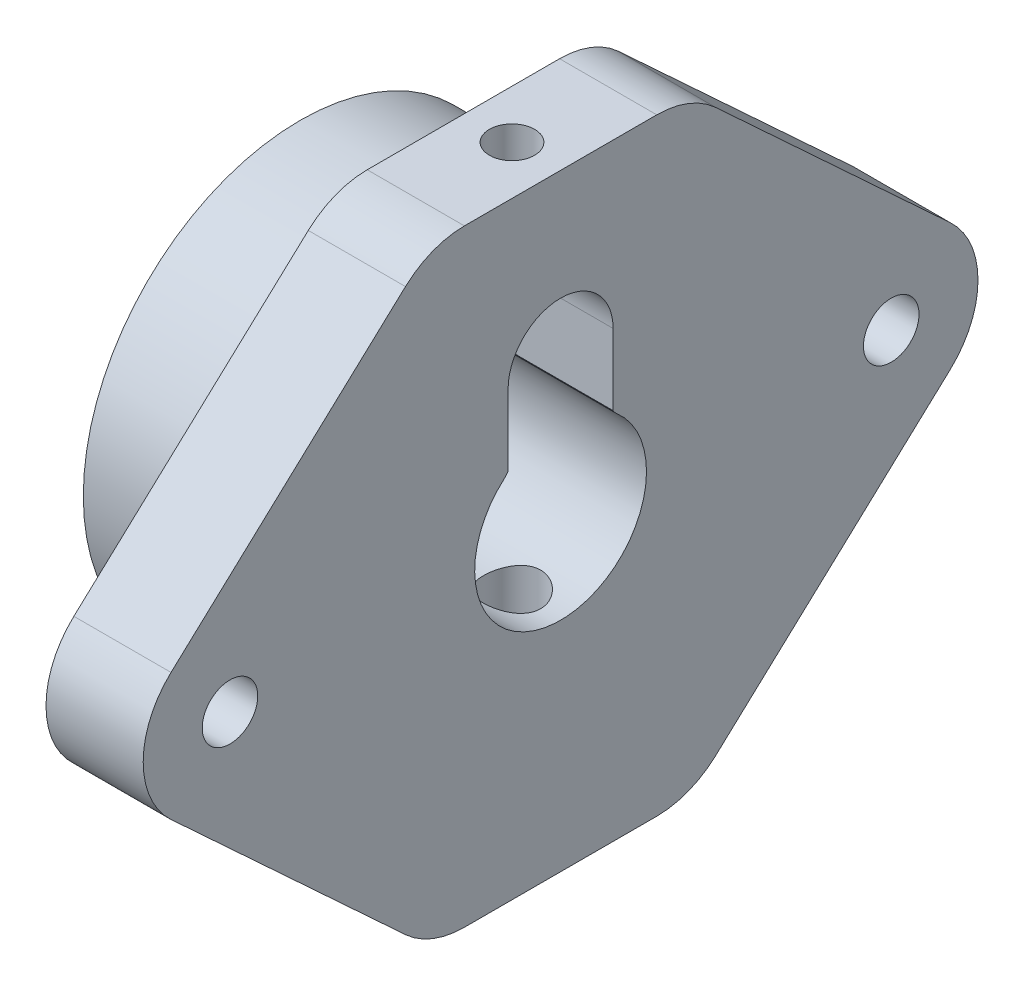
ISO-10303-21;
HEADER;
FILE_DESCRIPTION(('STEP AP214'),'2;1');
FILE_NAME('part.step','',(''),(''),'','','');
FILE_SCHEMA(('AUTOMOTIVE_DESIGN { 1 0 10303 214 1 1 1 1 }'));
ENDSEC;
DATA;
#1=APPLICATION_CONTEXT('core data for automotive mechanical design processes');
#2=APPLICATION_PROTOCOL_DEFINITION('international standard','automotive_design',2000,#1);
#3=PRODUCT_CONTEXT('',#1,'mechanical');
#4=PRODUCT('Part','Part','',(#3));
#5=PRODUCT_RELATED_PRODUCT_CATEGORY('part','',(#4));
#6=PRODUCT_DEFINITION_FORMATION('','',#4);
#7=PRODUCT_DEFINITION_CONTEXT('part definition',#1,'design');
#8=PRODUCT_DEFINITION('design','',#6,#7);
#9=PRODUCT_DEFINITION_SHAPE('','',#8);
#10=(LENGTH_UNIT() NAMED_UNIT(*) SI_UNIT(.MILLI.,.METRE.));
#11=(NAMED_UNIT(*) PLANE_ANGLE_UNIT() SI_UNIT($,.RADIAN.));
#12=(NAMED_UNIT(*) SI_UNIT($,.STERADIAN.) SOLID_ANGLE_UNIT());
#13=UNCERTAINTY_MEASURE_WITH_UNIT(LENGTH_MEASURE(1.E-05),#10,'distance_accuracy_value','');
#14=(GEOMETRIC_REPRESENTATION_CONTEXT(3) GLOBAL_UNCERTAINTY_ASSIGNED_CONTEXT((#13)) GLOBAL_UNIT_ASSIGNED_CONTEXT((#10,
#11,#12)) REPRESENTATION_CONTEXT('',''));
#15=CARTESIAN_POINT('',(0.,0.,0.));
#16=DIRECTION('',(0.,0.,1.));
#17=DIRECTION('',(1.,0.,0.));
#18=AXIS2_PLACEMENT_3D('',#15,#16,#17);
#19=CARTESIAN_POINT('',(0.,-17.5,0.));
#20=DIRECTION('',(0.,1.,0.));
#21=DIRECTION('',(0.,0.,1.));
#22=AXIS2_PLACEMENT_3D('',#19,#20,#21);
#23=PLANE('',#22);
#24=CARTESIAN_POINT('',(12.2,-17.5,0.));
#25=DIRECTION('',(0.,-1.,0.));
#26=DIRECTION('',(0.,0.,-1.));
#27=AXIS2_PLACEMENT_3D('',#24,#25,#26);
#28=CIRCLE('',#27,1.65);
#29=CARTESIAN_POINT('',(12.2,-17.5,-1.65));
#30=VERTEX_POINT('',#29);
#31=EDGE_CURVE('E421',#30,#30,#28,.T.);
#32=ORIENTED_EDGE('',*,*,#31,.F.);
#33=EDGE_LOOP('',(#32));
#34=FACE_BOUND('',#33,.T.);
#35=DIRECTION('',(0.,0.,1.));
#36=VECTOR('',#35,1.);
#37=CARTESIAN_POINT('',(9.4,-17.5,0.));
#38=LINE('',#37,#36);
#39=CARTESIAN_POINT('',(9.4,-17.5,-5.5415515668414));
#40=VERTEX_POINT('',#39);
#41=CARTESIAN_POINT('',(9.4,-17.5,5.5415515668414));
#42=VERTEX_POINT('',#41);
#43=EDGE_CURVE('E263',#40,#42,#38,.T.);
#44=ORIENTED_EDGE('',*,*,#43,.F.);
#45=DIRECTION('',(-1.,0.,0.));
#46=VECTOR('',#45,1.);
#47=CARTESIAN_POINT('',(15.,-17.5,-5.5415515668414));
#48=LINE('',#47,#46);
#49=CARTESIAN_POINT('',(15.,-17.5,-5.5415515668414));
#50=VERTEX_POINT('',#49);
#51=EDGE_CURVE('E458',#40,#50,#48,.F.);
#52=ORIENTED_EDGE('',*,*,#51,.T.);
#53=DIRECTION('',(0.,0.,1.));
#54=VECTOR('',#53,1.);
#55=CARTESIAN_POINT('',(15.,-17.5,0.));
#56=LINE('',#55,#54);
#57=CARTESIAN_POINT('',(15.,-17.5,5.5415515668414));
#58=VERTEX_POINT('',#57);
#59=EDGE_CURVE('E259',#50,#58,#56,.T.);
#60=ORIENTED_EDGE('',*,*,#59,.T.);
#61=DIRECTION('',(-1.,0.,0.));
#62=VECTOR('',#61,1.);
#63=CARTESIAN_POINT('',(0.,-17.5,5.5415515668414));
#64=LINE('',#63,#62);
#65=EDGE_CURVE('E460',#58,#42,#64,.T.);
#66=ORIENTED_EDGE('',*,*,#65,.T.);
#67=EDGE_LOOP('',(#44,#52,#60,#66));
#68=FACE_BOUND('',#67,.T.);
#69=ADVANCED_FACE('F35',(#34,#68),#23,.F.);
#70=CARTESIAN_POINT('',(0.,17.5,0.));
#71=DIRECTION('',(0.,1.,0.));
#72=DIRECTION('',(0.,0.,1.));
#73=AXIS2_PLACEMENT_3D('',#70,#71,#72);
#74=PLANE('',#73);
#75=CARTESIAN_POINT('',(12.2,17.5,0.));
#76=DIRECTION('',(0.,1.,0.));
#77=DIRECTION('',(0.,0.,1.));
#78=AXIS2_PLACEMENT_3D('',#75,#76,#77);
#79=CIRCLE('',#78,1.3);
#80=CARTESIAN_POINT('',(12.2,17.5,1.3));
#81=VERTEX_POINT('',#80);
#82=EDGE_CURVE('E256',#81,#81,#79,.T.);
#83=ORIENTED_EDGE('',*,*,#82,.F.);
#84=EDGE_LOOP('',(#83));
#85=FACE_BOUND('',#84,.T.);
#86=DIRECTION('',(0.,0.,1.));
#87=VECTOR('',#86,1.);
#88=CARTESIAN_POINT('',(15.,17.5,0.));
#89=LINE('',#88,#87);
#90=CARTESIAN_POINT('',(15.,17.5,-5.5415515668414));
#91=VERTEX_POINT('',#90);
#92=CARTESIAN_POINT('',(15.,17.5,5.5415515668414));
#93=VERTEX_POINT('',#92);
#94=EDGE_CURVE('E260',#91,#93,#89,.T.);
#95=ORIENTED_EDGE('',*,*,#94,.F.);
#96=DIRECTION('',(1.,0.,0.));
#97=VECTOR('',#96,1.);
#98=CARTESIAN_POINT('',(9.4,17.5,-5.5415515668414));
#99=LINE('',#98,#97);
#100=CARTESIAN_POINT('',(9.4,17.5,-5.5415515668414));
#101=VERTEX_POINT('',#100);
#102=EDGE_CURVE('E432',#91,#101,#99,.F.);
#103=ORIENTED_EDGE('',*,*,#102,.T.);
#104=DIRECTION('',(0.,0.,1.));
#105=VECTOR('',#104,1.);
#106=CARTESIAN_POINT('',(9.4,17.5,0.));
#107=LINE('',#106,#105);
#108=CARTESIAN_POINT('',(9.4,17.5,5.5415515668414));
#109=VERTEX_POINT('',#108);
#110=EDGE_CURVE('E268',#101,#109,#107,.T.);
#111=ORIENTED_EDGE('',*,*,#110,.T.);
#112=DIRECTION('',(1.,0.,0.));
#113=VECTOR('',#112,1.);
#114=CARTESIAN_POINT('',(0.,17.5,5.5415515668414));
#115=LINE('',#114,#113);
#116=EDGE_CURVE('E435',#109,#93,#115,.T.);
#117=ORIENTED_EDGE('',*,*,#116,.T.);
#118=EDGE_LOOP('',(#95,#103,#111,#117));
#119=FACE_BOUND('',#118,.T.);
#120=ADVANCED_FACE('F353',(#85,#119),#74,.T.);
#121=CARTESIAN_POINT('',(9.4,0.,0.));
#122=DIRECTION('',(1.,0.,0.));
#123=DIRECTION('',(0.,0.,-1.));
#124=AXIS2_PLACEMENT_3D('',#121,#122,#123);
#125=PLANE('',#124);
#126=DIRECTION('',(0.,0.679179156518478,-0.733972529016481));
#127=VECTOR('',#126,1.);
#128=CARTESIAN_POINT('',(9.4,-13.1662656073785,-12.1833622052587));
#129=LINE('',#128,#127);
#130=CARTESIAN_POINT('',(9.4,-16.1698626450824,-8.93744734943379));
#131=VERTEX_POINT('',#130);
#132=CARTESIAN_POINT('',(9.4,-3.6698626450824,-22.4458957825924));
#133=VERTEX_POINT('',#132);
#134=EDGE_CURVE('E228',#131,#133,#129,.T.);
#135=ORIENTED_EDGE('',*,*,#134,.F.);
#136=CARTESIAN_POINT('',(9.4,-12.5,-5.5415515668414));
#137=DIRECTION('',(1.,0.,0.));
#138=DIRECTION('',(0.,0.,-1.));
#139=AXIS2_PLACEMENT_3D('',#136,#137,#138);
#140=CIRCLE('',#139,5.);
#141=EDGE_CURVE('E463',#131,#40,#140,.F.);
#142=ORIENTED_EDGE('',*,*,#141,.T.);
#143=ORIENTED_EDGE('',*,*,#43,.T.);
#144=CARTESIAN_POINT('',(9.4,-12.5,5.5415515668414));
#145=DIRECTION('',(1.,0.,0.));
#146=DIRECTION('',(0.,0.,-1.));
#147=AXIS2_PLACEMENT_3D('',#144,#145,#146);
#148=CIRCLE('',#147,5.);
#149=CARTESIAN_POINT('',(9.4,-16.1698626450824,8.93744734943379));
#150=VERTEX_POINT('',#149);
#151=EDGE_CURVE('E465',#42,#150,#148,.F.);
#152=ORIENTED_EDGE('',*,*,#151,.T.);
#153=DIRECTION('',(0.,0.679179156518478,0.733972529016481));
#154=VECTOR('',#153,1.);
#155=CARTESIAN_POINT('',(9.4,-13.1662656073785,12.1833622052587));
#156=LINE('',#155,#154);
#157=CARTESIAN_POINT('',(9.4,-3.6698626450824,22.4458957825924));
#158=VERTEX_POINT('',#157);
#159=EDGE_CURVE('E230',#150,#158,#156,.T.);
#160=ORIENTED_EDGE('',*,*,#159,.T.);
#161=CARTESIAN_POINT('',(9.4,0.,19.05));
#162=DIRECTION('',(1.,0.,0.));
#163=DIRECTION('',(0.,0.,-1.));
#164=AXIS2_PLACEMENT_3D('',#161,#162,#163);
#165=CIRCLE('',#164,5.);
#166=CARTESIAN_POINT('',(9.4,3.6698626450824,22.4458957825924));
#167=VERTEX_POINT('',#166);
#168=EDGE_CURVE('E235',#167,#158,#165,.T.);
#169=ORIENTED_EDGE('',*,*,#168,.F.);
#170=DIRECTION('',(0.,-0.679179156518478,0.733972529016481));
#171=VECTOR('',#170,1.);
#172=CARTESIAN_POINT('',(9.4,13.1662656073785,12.1833622052587));
#173=LINE('',#172,#171);
#174=CARTESIAN_POINT('',(9.4,16.1698626450824,8.93744734943379));
#175=VERTEX_POINT('',#174);
#176=EDGE_CURVE('E226',#175,#167,#173,.T.);
#177=ORIENTED_EDGE('',*,*,#176,.F.);
#178=CARTESIAN_POINT('',(9.4,12.5,5.5415515668414));
#179=DIRECTION('',(1.,0.,0.));
#180=DIRECTION('',(0.,0.,-1.));
#181=AXIS2_PLACEMENT_3D('',#178,#179,#180);
#182=CIRCLE('',#181,5.);
#183=EDGE_CURVE('E467',#175,#109,#182,.F.);
#184=ORIENTED_EDGE('',*,*,#183,.T.);
#185=ORIENTED_EDGE('',*,*,#110,.F.);
#186=CARTESIAN_POINT('',(9.4,12.5,-5.5415515668414));
#187=DIRECTION('',(1.,0.,0.));
#188=DIRECTION('',(0.,0.,-1.));
#189=AXIS2_PLACEMENT_3D('',#186,#187,#188);
#190=CIRCLE('',#189,5.);
#191=CARTESIAN_POINT('',(9.4,16.1698626450824,-8.93744734943379));
#192=VERTEX_POINT('',#191);
#193=EDGE_CURVE('E440',#101,#192,#190,.F.);
#194=ORIENTED_EDGE('',*,*,#193,.T.);
#195=DIRECTION('',(0.,-0.679179156518478,-0.733972529016481));
#196=VECTOR('',#195,1.);
#197=CARTESIAN_POINT('',(9.4,13.1662656073785,-12.1833622052587));
#198=LINE('',#197,#196);
#199=CARTESIAN_POINT('',(9.4,3.6698626450824,-22.4458957825924));
#200=VERTEX_POINT('',#199);
#201=EDGE_CURVE('E209',#192,#200,#198,.T.);
#202=ORIENTED_EDGE('',*,*,#201,.T.);
#203=CARTESIAN_POINT('',(9.4,0.,-19.05));
#204=DIRECTION('',(1.,0.,0.));
#205=DIRECTION('',(0.,0.,-1.));
#206=AXIS2_PLACEMENT_3D('',#203,#204,#205);
#207=CIRCLE('',#206,5.);
#208=EDGE_CURVE('E232',#133,#200,#207,.T.);
#209=ORIENTED_EDGE('',*,*,#208,.F.);
#210=EDGE_LOOP('',(#135,#142,#143,#152,#160,#169,#177,#184,#185,#194,#202,#209));
#211=FACE_BOUND('',#210,.T.);
#212=CARTESIAN_POINT('',(9.4,0.,-19.05));
#213=DIRECTION('',(1.,0.,0.));
#214=DIRECTION('',(0.,0.,-1.));
#215=AXIS2_PLACEMENT_3D('',#212,#213,#214);
#216=CIRCLE('',#215,1.6);
#217=CARTESIAN_POINT('',(9.4,0.,-20.65));
#218=VERTEX_POINT('',#217);
#219=EDGE_CURVE('E248',#218,#218,#216,.T.);
#220=ORIENTED_EDGE('',*,*,#219,.T.);
#221=EDGE_LOOP('',(#220));
#222=FACE_BOUND('',#221,.T.);
#223=CARTESIAN_POINT('',(9.4,0.,19.05));
#224=DIRECTION('',(1.,0.,0.));
#225=DIRECTION('',(0.,0.,-1.));
#226=AXIS2_PLACEMENT_3D('',#223,#224,#225);
#227=CIRCLE('',#226,1.6);
#228=CARTESIAN_POINT('',(9.4,0.,17.45));
#229=VERTEX_POINT('',#228);
#230=EDGE_CURVE('E253',#229,#229,#227,.T.);
#231=ORIENTED_EDGE('',*,*,#230,.T.);
#232=EDGE_LOOP('',(#231));
#233=FACE_BOUND('',#232,.T.);
#234=CARTESIAN_POINT('',(9.4,0.,0.));
#235=DIRECTION('',(1.,0.,0.));
#236=DIRECTION('',(0.,0.,-1.));
#237=AXIS2_PLACEMENT_3D('',#234,#235,#236);
#238=CIRCLE('',#237,13.5);
#239=CARTESIAN_POINT('',(9.4,0.,-13.5));
#240=VERTEX_POINT('',#239);
#241=EDGE_CURVE('E277',#240,#240,#238,.F.);
#242=ORIENTED_EDGE('',*,*,#241,.F.);
#243=EDGE_LOOP('',(#242));
#244=FACE_BOUND('',#243,.T.);
#245=ADVANCED_FACE('F359',(#211,#222,#233,#244),#125,.F.);
#246=CARTESIAN_POINT('',(15.,0.,0.));
#247=DIRECTION('',(1.,0.,0.));
#248=DIRECTION('',(0.,0.,-1.));
#249=AXIS2_PLACEMENT_3D('',#246,#247,#248);
#250=PLANE('',#249);
#251=CARTESIAN_POINT('',(15.,0.,0.));
#252=DIRECTION('',(1.,0.,0.));
#253=DIRECTION('',(0.,0.,-1.));
#254=AXIS2_PLACEMENT_3D('',#251,#252,#253);
#255=CIRCLE('',#254,4.95);
#256=CARTESIAN_POINT('',(15.,3.74599685204216,3.23573910946019));
#257=VERTEX_POINT('',#256);
#258=CARTESIAN_POINT('',(15.,3.74599685204216,-3.23573910946019));
#259=VERTEX_POINT('',#258);
#260=EDGE_CURVE('E173',#257,#259,#255,.T.);
#261=ORIENTED_EDGE('',*,*,#260,.F.);
#262=CARTESIAN_POINT('',(15.,4.50276389285876,3.88942377803801));
#263=DIRECTION('',(1.,0.,0.));
#264=DIRECTION('',(0.,0.,-1.));
#265=AXIS2_PLACEMENT_3D('',#262,#263,#264);
#266=CIRCLE('',#265,1.);
#267=CARTESIAN_POINT('',(15.,4.,3.025));
#268=VERTEX_POINT('',#267);
#269=EDGE_CURVE('E166',#257,#268,#266,.T.);
#270=ORIENTED_EDGE('',*,*,#269,.T.);
#271=DIRECTION('',(0.,-1.,0.));
#272=VECTOR('',#271,1.);
#273=CARTESIAN_POINT('',(15.,4.,3.025));
#274=LINE('',#273,#272);
#275=CARTESIAN_POINT('',(15.,8.1,3.025));
#276=VERTEX_POINT('',#275);
#277=EDGE_CURVE('E171',#276,#268,#274,.T.);
#278=ORIENTED_EDGE('',*,*,#277,.F.);
#279=CARTESIAN_POINT('',(15.,8.1,0.));
#280=DIRECTION('',(1.,0.,0.));
#281=DIRECTION('',(0.,0.,-1.));
#282=AXIS2_PLACEMENT_3D('',#279,#280,#281);
#283=CIRCLE('',#282,3.025);
#284=CARTESIAN_POINT('',(15.,8.1,-3.025));
#285=VERTEX_POINT('',#284);
#286=EDGE_CURVE('E190',#285,#276,#283,.T.);
#287=ORIENTED_EDGE('',*,*,#286,.F.);
#288=DIRECTION('',(0.,1.,0.));
#289=VECTOR('',#288,1.);
#290=CARTESIAN_POINT('',(15.,4.,-3.025));
#291=LINE('',#290,#289);
#292=CARTESIAN_POINT('',(15.,4.,-3.025));
#293=VERTEX_POINT('',#292);
#294=EDGE_CURVE('E186',#293,#285,#291,.T.);
#295=ORIENTED_EDGE('',*,*,#294,.F.);
#296=CARTESIAN_POINT('',(15.,4.50276389285876,-3.88942377803801));
#297=DIRECTION('',(1.,0.,0.));
#298=DIRECTION('',(0.,0.,-1.));
#299=AXIS2_PLACEMENT_3D('',#296,#297,#298);
#300=CIRCLE('',#299,1.);
#301=EDGE_CURVE('E178',#293,#259,#300,.T.);
#302=ORIENTED_EDGE('',*,*,#301,.T.);
#303=EDGE_LOOP('',(#261,#270,#278,#287,#295,#302));
#304=FACE_BOUND('',#303,.T.);
#305=ORIENTED_EDGE('',*,*,#59,.F.);
#306=CARTESIAN_POINT('',(15.,-12.5,-5.5415515668414));
#307=DIRECTION('',(1.,0.,0.));
#308=DIRECTION('',(0.,0.,-1.));
#309=AXIS2_PLACEMENT_3D('',#306,#307,#308);
#310=CIRCLE('',#309,5.);
#311=CARTESIAN_POINT('',(15.,-16.1698626450824,-8.93744734943379));
#312=VERTEX_POINT('',#311);
#313=EDGE_CURVE('E451',#50,#312,#310,.T.);
#314=ORIENTED_EDGE('',*,*,#313,.T.);
#315=DIRECTION('',(0.,0.679179156518478,-0.733972529016481));
#316=VECTOR('',#315,1.);
#317=CARTESIAN_POINT('',(15.,-13.1662656073785,-12.1833622052587));
#318=LINE('',#317,#316);
#319=CARTESIAN_POINT('',(15.,-3.6698626450824,-22.4458957825924));
#320=VERTEX_POINT('',#319);
#321=EDGE_CURVE('E215',#312,#320,#318,.T.);
#322=ORIENTED_EDGE('',*,*,#321,.T.);
#323=CARTESIAN_POINT('',(15.,0.,-19.05));
#324=DIRECTION('',(1.,0.,0.));
#325=DIRECTION('',(0.,0.,-1.));
#326=AXIS2_PLACEMENT_3D('',#323,#324,#325);
#327=CIRCLE('',#326,5.);
#328=CARTESIAN_POINT('',(15.,3.6698626450824,-22.4458957825924));
#329=VERTEX_POINT('',#328);
#330=EDGE_CURVE('E212',#320,#329,#327,.T.);
#331=ORIENTED_EDGE('',*,*,#330,.T.);
#332=DIRECTION('',(0.,-0.679179156518478,-0.733972529016481));
#333=VECTOR('',#332,1.);
#334=CARTESIAN_POINT('',(15.,13.1662656073785,-12.1833622052587));
#335=LINE('',#334,#333);
#336=CARTESIAN_POINT('',(15.,16.1698626450824,-8.93744734943379));
#337=VERTEX_POINT('',#336);
#338=EDGE_CURVE('E218',#337,#329,#335,.T.);
#339=ORIENTED_EDGE('',*,*,#338,.F.);
#340=CARTESIAN_POINT('',(15.,12.5,-5.5415515668414));
#341=DIRECTION('',(1.,0.,0.));
#342=DIRECTION('',(0.,0.,-1.));
#343=AXIS2_PLACEMENT_3D('',#340,#341,#342);
#344=CIRCLE('',#343,5.);
#345=EDGE_CURVE('E438',#337,#91,#344,.T.);
#346=ORIENTED_EDGE('',*,*,#345,.T.);
#347=ORIENTED_EDGE('',*,*,#94,.T.);
#348=CARTESIAN_POINT('',(15.,12.5,5.5415515668414));
#349=DIRECTION('',(1.,0.,0.));
#350=DIRECTION('',(0.,0.,-1.));
#351=AXIS2_PLACEMENT_3D('',#348,#349,#350);
#352=CIRCLE('',#351,5.);
#353=CARTESIAN_POINT('',(15.,16.1698626450824,8.93744734943379));
#354=VERTEX_POINT('',#353);
#355=EDGE_CURVE('E456',#93,#354,#352,.T.);
#356=ORIENTED_EDGE('',*,*,#355,.T.);
#357=DIRECTION('',(0.,-0.679179156518478,0.733972529016481));
#358=VECTOR('',#357,1.);
#359=CARTESIAN_POINT('',(15.,13.1662656073785,12.1833622052587));
#360=LINE('',#359,#358);
#361=CARTESIAN_POINT('',(15.,3.6698626450824,22.4458957825924));
#362=VERTEX_POINT('',#361);
#363=EDGE_CURVE('E200',#354,#362,#360,.T.);
#364=ORIENTED_EDGE('',*,*,#363,.T.);
#365=CARTESIAN_POINT('',(15.,0.,19.05));
#366=DIRECTION('',(1.,0.,0.));
#367=DIRECTION('',(0.,0.,-1.));
#368=AXIS2_PLACEMENT_3D('',#365,#366,#367);
#369=CIRCLE('',#368,5.);
#370=CARTESIAN_POINT('',(15.,-3.6698626450824,22.4458957825924));
#371=VERTEX_POINT('',#370);
#372=EDGE_CURVE('E197',#362,#371,#369,.T.);
#373=ORIENTED_EDGE('',*,*,#372,.T.);
#374=DIRECTION('',(0.,0.679179156518478,0.733972529016481));
#375=VECTOR('',#374,1.);
#376=CARTESIAN_POINT('',(15.,-13.1662656073785,12.1833622052587));
#377=LINE('',#376,#375);
#378=CARTESIAN_POINT('',(15.,-16.1698626450824,8.93744734943379));
#379=VERTEX_POINT('',#378);
#380=EDGE_CURVE('E203',#379,#371,#377,.T.);
#381=ORIENTED_EDGE('',*,*,#380,.F.);
#382=CARTESIAN_POINT('',(15.,-12.5,5.5415515668414));
#383=DIRECTION('',(1.,0.,0.));
#384=DIRECTION('',(0.,0.,-1.));
#385=AXIS2_PLACEMENT_3D('',#382,#383,#384);
#386=CIRCLE('',#385,5.);
#387=EDGE_CURVE('E453',#379,#58,#386,.T.);
#388=ORIENTED_EDGE('',*,*,#387,.T.);
#389=EDGE_LOOP('',(#305,#314,#322,#331,#339,#346,#347,#356,#364,#373,#381,#388));
#390=FACE_BOUND('',#389,.T.);
#391=CARTESIAN_POINT('',(15.,0.,19.05));
#392=DIRECTION('',(1.,0.,0.));
#393=DIRECTION('',(0.,0.,-1.));
#394=AXIS2_PLACEMENT_3D('',#391,#392,#393);
#395=CIRCLE('',#394,1.6);
#396=CARTESIAN_POINT('',(15.,0.,17.45));
#397=VERTEX_POINT('',#396);
#398=EDGE_CURVE('E245',#397,#397,#395,.T.);
#399=ORIENTED_EDGE('',*,*,#398,.F.);
#400=EDGE_LOOP('',(#399));
#401=FACE_BOUND('',#400,.T.);
#402=CARTESIAN_POINT('',(15.,0.,-19.05));
#403=DIRECTION('',(1.,0.,0.));
#404=DIRECTION('',(0.,0.,1.));
#405=AXIS2_PLACEMENT_3D('',#402,#403,#404);
#406=CIRCLE('',#405,1.6);
#407=CARTESIAN_POINT('',(15.,0.,-17.45));
#408=VERTEX_POINT('',#407);
#409=EDGE_CURVE('E244',#408,#408,#406,.T.);
#410=ORIENTED_EDGE('',*,*,#409,.F.);
#411=EDGE_LOOP('',(#410));
#412=FACE_BOUND('',#411,.T.);
#413=ADVANCED_FACE('F168',(#304,#390,#401,#412),#250,.T.);
#414=CARTESIAN_POINT('',(15.,0.,0.));
#415=DIRECTION('',(-1.,0.,0.));
#416=DIRECTION('',(0.,0.,1.));
#417=AXIS2_PLACEMENT_3D('',#414,#415,#416);
#418=CYLINDRICAL_SURFACE('',#417,12.5);
#419=CARTESIAN_POINT('',(8.9,0.,0.));
#420=DIRECTION('',(-1.,0.,0.));
#421=DIRECTION('',(0.,0.,1.));
#422=AXIS2_PLACEMENT_3D('',#419,#420,#421);
#423=CIRCLE('',#422,12.5);
#424=CARTESIAN_POINT('',(8.9,0.,12.5));
#425=VERTEX_POINT('',#424);
#426=EDGE_CURVE('E238',#425,#425,#423,.T.);
#427=ORIENTED_EDGE('',*,*,#426,.T.);
#428=EDGE_LOOP('',(#427));
#429=FACE_BOUND('',#428,.T.);
#430=CARTESIAN_POINT('',(0.,0.,0.));
#431=DIRECTION('',(1.,0.,0.));
#432=DIRECTION('',(0.,0.,-1.));
#433=AXIS2_PLACEMENT_3D('',#430,#431,#432);
#434=CIRCLE('',#433,12.5);
#435=CARTESIAN_POINT('',(0.,0.,-12.5));
#436=VERTEX_POINT('',#435);
#437=EDGE_CURVE('E273',#436,#436,#434,.T.);
#438=ORIENTED_EDGE('',*,*,#437,.T.);
#439=EDGE_LOOP('',(#438));
#440=FACE_BOUND('',#439,.T.);
#441=ADVANCED_FACE('F373',(#429,#440),#418,.T.);
#442=CARTESIAN_POINT('',(0.,0.,0.));
#443=DIRECTION('',(1.,0.,0.));
#444=DIRECTION('',(0.,0.,-1.));
#445=AXIS2_PLACEMENT_3D('',#442,#443,#444);
#446=PLANE('',#445);
#447=DIRECTION('',(0.,1.,0.));
#448=VECTOR('',#447,1.);
#449=CARTESIAN_POINT('',(0.,4.,3.025));
#450=LINE('',#449,#448);
#451=CARTESIAN_POINT('',(0.,4.,3.025));
#452=VERTEX_POINT('',#451);
#453=CARTESIAN_POINT('',(0.,8.1,3.025));
#454=VERTEX_POINT('',#453);
#455=EDGE_CURVE('E288',#452,#454,#450,.T.);
#456=ORIENTED_EDGE('',*,*,#455,.F.);
#457=CARTESIAN_POINT('',(0.,4.50276389285876,3.88942377803801));
#458=DIRECTION('',(1.,0.,0.));
#459=DIRECTION('',(0.,0.,-1.));
#460=AXIS2_PLACEMENT_3D('',#457,#458,#459);
#461=CIRCLE('',#460,1.);
#462=CARTESIAN_POINT('',(0.,3.74599685204216,3.23573910946019));
#463=VERTEX_POINT('',#462);
#464=EDGE_CURVE('E11',#452,#463,#461,.F.);
#465=ORIENTED_EDGE('',*,*,#464,.T.);
#466=CARTESIAN_POINT('',(0.,0.,0.));
#467=DIRECTION('',(1.,0.,0.));
#468=DIRECTION('',(0.,0.,-1.));
#469=AXIS2_PLACEMENT_3D('',#466,#467,#468);
#470=CIRCLE('',#469,4.95);
#471=CARTESIAN_POINT('',(0.,3.74599685204216,-3.23573910946019));
#472=VERTEX_POINT('',#471);
#473=EDGE_CURVE('E271',#463,#472,#470,.T.);
#474=ORIENTED_EDGE('',*,*,#473,.T.);
#475=CARTESIAN_POINT('',(0.,4.50276389285876,-3.88942377803801));
#476=DIRECTION('',(1.,0.,0.));
#477=DIRECTION('',(0.,0.,-1.));
#478=AXIS2_PLACEMENT_3D('',#475,#476,#477);
#479=CIRCLE('',#478,1.);
#480=CARTESIAN_POINT('',(0.,4.,-3.025));
#481=VERTEX_POINT('',#480);
#482=EDGE_CURVE('E49',#472,#481,#479,.F.);
#483=ORIENTED_EDGE('',*,*,#482,.T.);
#484=DIRECTION('',(0.,-1.,0.));
#485=VECTOR('',#484,1.);
#486=CARTESIAN_POINT('',(0.,4.,-3.025));
#487=LINE('',#486,#485);
#488=CARTESIAN_POINT('',(0.,8.1,-3.025));
#489=VERTEX_POINT('',#488);
#490=EDGE_CURVE('E413',#489,#481,#487,.T.);
#491=ORIENTED_EDGE('',*,*,#490,.F.);
#492=CARTESIAN_POINT('',(0.,8.1,0.));
#493=DIRECTION('',(1.,0.,0.));
#494=DIRECTION('',(0.,0.,-1.));
#495=AXIS2_PLACEMENT_3D('',#492,#493,#494);
#496=CIRCLE('',#495,3.025);
#497=EDGE_CURVE('E416',#454,#489,#496,.F.);
#498=ORIENTED_EDGE('',*,*,#497,.F.);
#499=EDGE_LOOP('',(#456,#465,#474,#483,#491,#498));
#500=FACE_BOUND('',#499,.T.);
#501=ORIENTED_EDGE('',*,*,#437,.F.);
#502=EDGE_LOOP('',(#501));
#503=FACE_BOUND('',#502,.T.);
#504=ADVANCED_FACE('F366',(#500,#503),#446,.F.);
#505=CARTESIAN_POINT('',(0.,0.,0.));
#506=DIRECTION('',(1.,0.,0.));
#507=DIRECTION('',(0.,0.,-1.));
#508=AXIS2_PLACEMENT_3D('',#505,#506,#507);
#509=CYLINDRICAL_SURFACE('',#508,4.95);
#510=CARTESIAN_POINT('',(12.2,-4.66690475583121,-1.65));
#511=CARTESIAN_POINT('',(12.2898724884795,-4.66690445975216,-1.65000042561373));
#512=CARTESIAN_POINT('',(12.3797424197089,-4.66952919329915,-1.64263239308111));
#513=CARTESIAN_POINT('',(12.5568197946405,-4.67968997234071,-1.61345436728653));
#514=CARTESIAN_POINT('',(12.6440267972896,-4.68722682684611,-1.59164199507786));
#515=CARTESIAN_POINT('',(12.8131843734455,-4.70626536086506,-1.53442655138009));
#516=CARTESIAN_POINT('',(12.8951448835805,-4.71775926552681,-1.49905011531536));
#517=CARTESIAN_POINT('',(13.0519940801041,-4.74340551317036,-1.41580168692828));
#518=CARTESIAN_POINT('',(13.1268812012135,-4.7575584425096,-1.3679269376193));
#519=CARTESIAN_POINT('',(13.2703879378582,-4.78754907522331,-1.25903439163075));
#520=CARTESIAN_POINT('',(13.3386904573083,-4.80342876493663,-1.19761016327357));
#521=CARTESIAN_POINT('',(13.4642412220207,-4.83472876921655,-1.06422965090375));
#522=CARTESIAN_POINT('',(13.5214876921109,-4.85014900967787,-0.992271678836421));
#523=CARTESIAN_POINT('',(13.6247401805938,-4.87927880420968,-0.837547438142268));
#524=CARTESIAN_POINT('',(13.6704139515196,-4.89293322707649,-0.754548153520467));
#525=CARTESIAN_POINT('',(13.7470261154604,-4.91649818172122,-0.581511517929333));
#526=CARTESIAN_POINT('',(13.7779684797419,-4.92640972234953,-0.491476071383901));
#527=CARTESIAN_POINT('',(13.8231641601434,-4.94107474462647,-0.310247548765267));
#528=CARTESIAN_POINT('',(13.8379606863241,-4.94599569382975,-0.219203745507398));
#529=CARTESIAN_POINT('',(13.8521718840451,-4.95071953560107,-0.0358014934597507));
#530=CARTESIAN_POINT('',(13.8515905202265,-4.95052374733769,0.0565566103474223));
#531=CARTESIAN_POINT('',(13.835406979966,-4.94514965370915,0.236120800069797));
#532=CARTESIAN_POINT('',(13.8203948280171,-4.94016706845973,0.32338688017625));
#533=CARTESIAN_POINT('',(13.7767515813822,-4.92602496110528,0.494081674056564));
#534=CARTESIAN_POINT('',(13.7481195636834,-4.9168651559134,0.577510127335638));
#535=CARTESIAN_POINT('',(13.6777048264449,-4.89514855983932,0.739451583489321));
#536=CARTESIAN_POINT('',(13.6357542013978,-4.88254870165045,0.817885564598847));
#537=CARTESIAN_POINT('',(13.5400314860102,-4.85526348513797,0.966775137119829));
#538=CARTESIAN_POINT('',(13.486256108511,-4.84057754730855,1.03722850173487));
#539=CARTESIAN_POINT('',(13.3654372507898,-4.80985216553969,1.17166642981065));
#540=CARTESIAN_POINT('',(13.297888289555,-4.793781550349,1.23519025916147));
#541=CARTESIAN_POINT('',(13.1529596025576,-4.76268103154433,1.35015747833322));
#542=CARTESIAN_POINT('',(13.0755783645732,-4.74765128856892,1.40159900640046));
#543=CARTESIAN_POINT('',(12.9117215177346,-4.72016366473626,1.49157930082051));
#544=CARTESIAN_POINT('',(12.8251319832431,-4.70774550409055,1.52992366502423));
#545=CARTESIAN_POINT('',(12.6462071994607,-4.68734723949193,1.59133126894419));
#546=CARTESIAN_POINT('',(12.553874375984,-4.67936527577018,1.61440091299662));
#547=CARTESIAN_POINT('',(12.370546713589,-4.66916399898416,1.64366611544928));
#548=CARTESIAN_POINT('',(12.2796794491696,-4.6667009451998,1.65057600758448));
#549=CARTESIAN_POINT('',(12.0980693539569,-4.66713508903621,1.64934897420415));
#550=CARTESIAN_POINT('',(12.0073265035591,-4.67003131308067,1.64121478162498));
#551=CARTESIAN_POINT('',(11.8317910065766,-4.68061469847475,1.61077232506052));
#552=CARTESIAN_POINT('',(11.7469010402514,-4.68813386976979,1.58896055006792));
#553=CARTESIAN_POINT('',(11.582003049705,-4.70693113557595,1.53237787322498));
#554=CARTESIAN_POINT('',(11.5019958938751,-4.71820989642596,1.49760467399971));
#555=CARTESIAN_POINT('',(11.3463223056025,-4.74369848032934,1.41483266221919));
#556=CARTESIAN_POINT('',(11.2708740396411,-4.75798992348256,1.36644934529151));
#557=CARTESIAN_POINT('',(11.1289090135668,-4.78773518406123,1.25826629041999));
#558=CARTESIAN_POINT('',(11.062394896209,-4.80318934332269,1.198463187073));
#559=CARTESIAN_POINT('',(10.9368788262505,-4.83441813752442,1.06572131473554));
#560=CARTESIAN_POINT('',(10.8783922564689,-4.85017241903527,0.992288996401978));
#561=CARTESIAN_POINT('',(10.7745383651257,-4.87949305161632,0.836265030810428));
#562=CARTESIAN_POINT('',(10.729170577582,-4.89305948039197,0.753673709026514));
#563=CARTESIAN_POINT('',(10.6532568269782,-4.91641269587494,0.58208677301329));
#564=CARTESIAN_POINT('',(10.6226143927057,-4.92622399507476,0.493137353479977));
#565=CARTESIAN_POINT('',(10.5768492256008,-4.94106707882328,0.31095646864593));
#566=CARTESIAN_POINT('',(10.5617208906972,-4.94610058856131,0.21772656172392));
#567=CARTESIAN_POINT('',(10.5479175719507,-4.95069074339823,0.0343453041690693));
#568=CARTESIAN_POINT('',(10.5485027010116,-4.95049368147575,-0.055744794468029));
#569=CARTESIAN_POINT('',(10.5642845584416,-4.94525124257007,-0.234483389250285));
#570=CARTESIAN_POINT('',(10.5794801014521,-4.940206258904,-0.323132001751442));
#571=CARTESIAN_POINT('',(10.6235606870503,-4.9259250967478,-0.495069497062895));
#572=CARTESIAN_POINT('',(10.6522244553323,-4.91675676295895,-0.5784211470061));
#573=CARTESIAN_POINT('',(10.7222229263103,-4.89517315162417,-0.739164279050661));
#574=CARTESIAN_POINT('',(10.7635599210751,-4.88275728679227,-0.816554679835011));
#575=CARTESIAN_POINT('',(10.8594896949683,-4.85538683566004,-0.966296126909494));
#576=CARTESIAN_POINT('',(10.9145158308797,-4.84035539611679,-1.03835531507005));
#577=CARTESIAN_POINT('',(11.0355246954077,-4.80963431506601,-1.1724586933495));
#578=CARTESIAN_POINT('',(11.1015109197335,-4.7939444647561,-1.23449967568058));
#579=CARTESIAN_POINT('',(11.2456554367185,-4.76294411712237,-1.34927398457464));
#580=CARTESIAN_POINT('',(11.3241890931115,-4.74767251181241,-1.40154789389654));
#581=CARTESIAN_POINT('',(11.4894018043896,-4.71999318982975,-1.49211866644684));
#582=CARTESIAN_POINT('',(11.5760787234989,-4.70758472516061,-1.53041918175213));
#583=CARTESIAN_POINT('',(11.7511370096258,-4.68767201440749,-1.59034231653687));
#584=CARTESIAN_POINT('',(11.8392642348169,-4.67997144214351,-1.61264055009671));
#585=CARTESIAN_POINT('',(12.0182624832701,-4.66958882840205,-1.64246662824629));
#586=CARTESIAN_POINT('',(12.1091325487277,-4.66690505518811,-1.64999956967438));
#587=CARTESIAN_POINT('',(12.2,-4.66690475583121,-1.65));
#588=B_SPLINE_CURVE_WITH_KNOTS('',3,(#510,#511,#512,#513,#514,#515,#516,#517,#518,#519,#520,
#521,#522,#523,#524,#525,#526,#527,#528,#529,#530,#531,#532,#533,#534,#535,#536,#537,#538,#539,
#540,#541,#542,#543,#544,#545,#546,#547,#548,#549,#550,#551,#552,#553,#554,#555,#556,#557,#558,
#559,#560,#561,#562,#563,#564,#565,#566,#567,#568,#569,#570,#571,#572,#573,#574,#575,#576,#577,
#578,#579,#580,#581,#582,#583,#584,#585,#586,#587),.UNSPECIFIED.,.T.,.F.,(4,2,2,2,2,2,2,2,2,2,2,
2,2,2,2,2,2,2,2,2,2,2,2,2,2,2,2,2,2,2,2,2,2,2,2,2,2,2,4),(0.,0.269280964918936,
0.538606290775019,0.807405435376363,1.07626392420598,1.35467206755487,1.6331248753378,
1.91884285137034,2.20448376038202,2.48018625962141,2.7558176794884,3.02063857962189,
3.2854774291224,3.55379730519553,3.82219186592136,4.10322287700464,4.38429716359975,
4.66937855739307,4.95434034734623,5.22644580747532,5.49850184127643,5.76121253014688,
6.02396980588667,6.29506115260136,6.56623251338717,6.8504503347851,7.13465805946135,
7.41697755461112,7.69919506953065,7.96814839714306,8.23707990612346,8.50173977462916,
8.76644753755557,9.04093607205253,9.31551232310049,9.60083689510846,9.88608684136537,
10.1584430006465,10.4307051286047),.UNSPECIFIED.);
#589=CARTESIAN_POINT('',(12.2,-4.66690475583121,-1.65));
#590=VERTEX_POINT('',#589);
#591=EDGE_CURVE('E39',#590,#590,#588,.T.);
#592=ORIENTED_EDGE('',*,*,#591,.T.);
#593=EDGE_LOOP('',(#592));
#594=FACE_BOUND('',#593,.T.);
#595=ORIENTED_EDGE('',*,*,#473,.F.);
#596=DIRECTION('',(1.,0.,0.));
#597=VECTOR('',#596,1.);
#598=CARTESIAN_POINT('',(0.,3.74599685204216,3.23573910946019));
#599=LINE('',#598,#597);
#600=EDGE_CURVE('E404',#463,#257,#599,.T.);
#601=ORIENTED_EDGE('',*,*,#600,.T.);
#602=ORIENTED_EDGE('',*,*,#260,.T.);
#603=DIRECTION('',(1.,0.,0.));
#604=VECTOR('',#603,1.);
#605=CARTESIAN_POINT('',(0.,3.74599685204216,-3.23573910946019));
#606=LINE('',#605,#604);
#607=EDGE_CURVE('E402',#259,#472,#606,.F.);
#608=ORIENTED_EDGE('',*,*,#607,.T.);
#609=EDGE_LOOP('',(#595,#601,#602,#608));
#610=FACE_BOUND('',#609,.T.);
#611=ADVANCED_FACE('F349',(#594,#610),#509,.F.);
#612=CARTESIAN_POINT('',(12.2,-17.5,0.));
#613=DIRECTION('',(0.,1.,0.));
#614=DIRECTION('',(0.,0.,1.));
#615=AXIS2_PLACEMENT_3D('',#612,#613,#614);
#616=CYLINDRICAL_SURFACE('',#615,1.3);
#617=CARTESIAN_POINT('',(12.2,10.8314144687323,1.3));
#618=CARTESIAN_POINT('',(12.1308876506826,10.8314227798751,1.29999161807218));
#619=CARTESIAN_POINT('',(12.0616719975329,10.834076036633,1.29445372552182));
#620=CARTESIAN_POINT('',(11.9252519014467,10.8443481615254,1.27252275432604));
#621=CARTESIAN_POINT('',(11.8580532449059,10.8519801087041,1.2561010821177));
#622=CARTESIAN_POINT('',(11.7278931902073,10.8711696408757,1.21317348551913));
#623=CARTESIAN_POINT('',(11.6649150918402,10.8827105067166,1.18671045279461));
#624=CARTESIAN_POINT('',(11.5443092157135,10.9083937455912,1.12457776995998));
#625=CARTESIAN_POINT('',(11.4866804122719,10.922535618347,1.08890988977984));
#626=CARTESIAN_POINT('',(11.3745559177326,10.9528747959856,1.00685314681357));
#627=CARTESIAN_POINT('',(11.3204571134705,10.9691445669566,0.959948510229006));
#628=CARTESIAN_POINT('',(11.2205978377677,11.0013126672147,0.857831263935769));
#629=CARTESIAN_POINT('',(11.1748407030305,11.0172108456562,0.802615345731499));
#630=CARTESIAN_POINT('',(11.0908930428445,11.0477349369212,0.682281418205256));
#631=CARTESIAN_POINT('',(11.0531552029946,11.0622668713447,0.616821588065415));
#632=CARTESIAN_POINT('',(10.9894006298714,11.0875266549564,0.479744417967518));
#633=CARTESIAN_POINT('',(10.9633783783208,11.0982562945937,0.408129995915735));
#634=CARTESIAN_POINT('',(10.9252511532447,11.1141875234017,0.264949417659497));
#635=CARTESIAN_POINT('',(10.9124601120766,11.1196604365136,0.19359676957662));
#636=CARTESIAN_POINT('',(10.8989353100812,11.1254511143997,0.0495623228984184));
#637=CARTESIAN_POINT('',(10.8981963266702,11.1257711121139,-0.0231188863142906));
#638=CARTESIAN_POINT('',(10.9084507046513,11.1213752395524,-0.162734841581258));
#639=CARTESIAN_POINT('',(10.9186884765297,11.1169836788269,-0.229737259308845));
#640=CARTESIAN_POINT('',(10.9493023030143,11.1041101331758,-0.360965125772611));
#641=CARTESIAN_POINT('',(10.9696791069875,11.0956278459096,-0.425190368868828));
#642=CARTESIAN_POINT('',(11.0202255973747,11.0752229531237,-0.550228404071358));
#643=CARTESIAN_POINT('',(11.0505403735995,11.0632496863922,-0.610973934348218));
#644=CARTESIAN_POINT('',(11.1199543693881,11.03702095928,-0.726675613107701));
#645=CARTESIAN_POINT('',(11.1590567491339,11.0227646784173,-0.781629668401121));
#646=CARTESIAN_POINT('',(11.2483090929051,10.9921370435846,-0.88853018141651));
#647=CARTESIAN_POINT('',(11.2990640503571,10.9756872413535,-0.939949753933767));
#648=CARTESIAN_POINT('',(11.4084897934591,10.943305152102,-1.03378427341011));
#649=CARTESIAN_POINT('',(11.4671640152539,10.9273730934731,-1.07619529090983));
#650=CARTESIAN_POINT('',(11.5934782939822,10.8972490876597,-1.15228576858));
#651=CARTESIAN_POINT('',(11.6613690010811,10.8831428567707,-1.18558604807587));
#652=CARTESIAN_POINT('',(11.8025606021069,10.8593049573033,-1.24006277800665));
#653=CARTESIAN_POINT('',(11.8758572925436,10.8495699307324,-1.2612485383413));
#654=CARTESIAN_POINT('',(12.0204896205036,10.8364250229296,-1.28950825605441));
#655=CARTESIAN_POINT('',(12.0916219363386,10.8326314566677,-1.29744068666562));
#656=CARTESIAN_POINT('',(12.2342872364307,10.8306998937752,-1.301503436036));
#657=CARTESIAN_POINT('',(12.3058200560904,10.8325597228407,-1.29763829215672));
#658=CARTESIAN_POINT('',(12.4419697338424,10.8413269797662,-1.27900024844415));
#659=CARTESIAN_POINT('',(12.5067201600215,10.8478718967757,-1.26500997259813));
#660=CARTESIAN_POINT('',(12.6328923371597,10.8647977512262,-1.22757369804552));
#661=CARTESIAN_POINT('',(12.6943132721979,10.8751796241173,-1.20412539334323));
#662=CARTESIAN_POINT('',(12.8150803743961,10.8991586658848,-1.14731118502582));
#663=CARTESIAN_POINT('',(12.8742194500138,10.9128762466275,-1.11355758305417));
#664=CARTESIAN_POINT('',(12.986289719371,10.9418197689616,-1.03746844414756));
#665=CARTESIAN_POINT('',(13.0392180932219,10.9570463899701,-0.99512903255592));
#666=CARTESIAN_POINT('',(13.1421973803386,10.9889020742186,-0.898701379254657));
#667=CARTESIAN_POINT('',(13.1915894500698,11.0055370815475,-0.843908622261946));
#668=CARTESIAN_POINT('',(13.28060934293,11.0371085381457,-0.726439161564802));
#669=CARTESIAN_POINT('',(13.3202361602969,11.0520448123706,-0.663761646781105));
#670=CARTESIAN_POINT('',(13.3886549727154,11.0786784330199,-0.531655370019342));
#671=CARTESIAN_POINT('',(13.417389969204,11.0903586580885,-0.462193421001003));
#672=CARTESIAN_POINT('',(13.4625434778642,11.1090221357703,-0.318786802192721));
#673=CARTESIAN_POINT('',(13.4789698402844,11.1160083818332,-0.244845022152144));
#674=CARTESIAN_POINT('',(13.4980059681337,11.1241326369754,-0.100446378082859));
#675=CARTESIAN_POINT('',(13.5015428799366,11.1256629047071,-0.0301330617155893));
#676=CARTESIAN_POINT('',(13.497228027262,11.1238089919543,0.110069116842996));
#677=CARTESIAN_POINT('',(13.4893784922936,11.1204257735486,0.179958059437797));
#678=CARTESIAN_POINT('',(13.463178663205,11.1093376987353,0.314470149062593));
#679=CARTESIAN_POINT('',(13.4452555187947,11.1018088762379,0.379192247972913));
#680=CARTESIAN_POINT('',(13.399898528691,11.083279119491,0.504675210988239));
#681=CARTESIAN_POINT('',(13.3724629383675,11.0722775483552,0.565435346018954));
#682=CARTESIAN_POINT('',(13.3074689696587,11.047231536277,0.684332529217096));
#683=CARTESIAN_POINT('',(13.269505618121,11.0330711036392,0.742223169520875));
#684=CARTESIAN_POINT('',(13.1851079115474,11.0033607479195,0.851063762202847));
#685=CARTESIAN_POINT('',(13.1386701858052,10.9878102732045,0.902010938662939));
#686=CARTESIAN_POINT('',(13.0346496557954,10.9556339334031,0.999399551094754));
#687=CARTESIAN_POINT('',(12.9765003468571,10.9390125376993,1.04523952780828));
#688=CARTESIAN_POINT('',(12.8528464962951,10.9077150482456,1.12661857074128));
#689=CARTESIAN_POINT('',(12.7873376852448,10.8930400945501,1.16215161440032));
#690=CARTESIAN_POINT('',(12.6506596423276,10.8675298791639,1.2216607848545));
#691=CARTESIAN_POINT('',(12.5794985879125,10.8566891897885,1.2456532656405));
#692=CARTESIAN_POINT('',(12.4336570735379,10.8404427476213,1.28101259056931));
#693=CARTESIAN_POINT('',(12.3589893063107,10.8350187698114,1.2924217859389));
#694=CARTESIAN_POINT('',(12.2559964680595,10.8318420727909,1.29909876420618));
#695=CARTESIAN_POINT('',(12.2280067160538,10.8314111007696,1.30000339664727));
#696=CARTESIAN_POINT('',(12.2,10.8314144687323,1.3));
#697=B_SPLINE_CURVE_WITH_KNOTS('',3,(#617,#618,#619,#620,#621,#622,#623,#624,#625,#626,#627,
#628,#629,#630,#631,#632,#633,#634,#635,#636,#637,#638,#639,#640,#641,#642,#643,#644,#645,#646,
#647,#648,#649,#650,#651,#652,#653,#654,#655,#656,#657,#658,#659,#660,#661,#662,#663,#664,#665,
#666,#667,#668,#669,#670,#671,#672,#673,#674,#675,#676,#677,#678,#679,#680,#681,#682,#683,#684,
#685,#686,#687,#688,#689,#690,#691,#692,#693,#694,#695,#696),.UNSPECIFIED.,.T.,.F.,(4,2,2,2,2,2,
2,2,2,2,2,2,2,2,2,2,2,2,2,2,2,2,2,2,2,2,2,2,2,2,2,2,2,2,2,2,2,2,2,4),(0.,0.207252800658675,
0.415052259934983,0.6219739176626,0.828855817607871,1.04818018028636,1.26759208206788,
1.49724187678594,1.72678338838107,1.94371392989449,2.16055046521751,2.36336512544599,
2.566194777756,2.77212835894948,2.97813611644839,3.19945112407286,3.42086247018268,
3.65042968551854,3.87982024258101,4.09367688328878,4.3074512848363,4.5062588293619,
4.70511487519064,4.91263764334053,5.12025427288921,5.34606868262167,5.57190634016792,
5.79891003892265,6.02576883485872,6.23594623057629,6.44608247832243,6.64791602983616,
6.8497866182303,7.06087369930003,7.27204492457813,7.49865007743399,7.72538737499612,
7.95180241232167,8.1774530628751,8.26143907111724),.UNSPECIFIED.);
#698=CARTESIAN_POINT('',(12.2,10.8314144687323,1.3));
#699=VERTEX_POINT('',#698);
#700=EDGE_CURVE('E216',#699,#699,#697,.T.);
#701=ORIENTED_EDGE('',*,*,#700,.T.);
#702=EDGE_LOOP('',(#701));
#703=FACE_BOUND('',#702,.T.);
#704=ORIENTED_EDGE('',*,*,#82,.T.);
#705=EDGE_LOOP('',(#704));
#706=FACE_BOUND('',#705,.T.);
#707=ADVANCED_FACE('F290',(#703,#706),#616,.F.);
#708=CARTESIAN_POINT('',(0.,0.,-19.05));
#709=DIRECTION('',(1.,0.,0.));
#710=DIRECTION('',(0.,0.,-1.));
#711=AXIS2_PLACEMENT_3D('',#708,#709,#710);
#712=CYLINDRICAL_SURFACE('',#711,1.6);
#713=ORIENTED_EDGE('',*,*,#409,.T.);
#714=EDGE_LOOP('',(#713));
#715=FACE_BOUND('',#714,.T.);
#716=ORIENTED_EDGE('',*,*,#219,.F.);
#717=EDGE_LOOP('',(#716));
#718=FACE_BOUND('',#717,.T.);
#719=ADVANCED_FACE('F342',(#715,#718),#712,.F.);
#720=CARTESIAN_POINT('',(0.,0.,19.05));
#721=DIRECTION('',(1.,0.,0.));
#722=DIRECTION('',(0.,0.,-1.));
#723=AXIS2_PLACEMENT_3D('',#720,#721,#722);
#724=CYLINDRICAL_SURFACE('',#723,1.6);
#725=ORIENTED_EDGE('',*,*,#398,.T.);
#726=EDGE_LOOP('',(#725));
#727=FACE_BOUND('',#726,.T.);
#728=ORIENTED_EDGE('',*,*,#230,.F.);
#729=EDGE_LOOP('',(#728));
#730=FACE_BOUND('',#729,.T.);
#731=ADVANCED_FACE('F336',(#727,#730),#724,.F.);
#732=CARTESIAN_POINT('',(8.9,0.,0.));
#733=DIRECTION('',(-1.,0.,0.));
#734=DIRECTION('',(0.,0.,1.));
#735=AXIS2_PLACEMENT_3D('',#732,#733,#734);
#736=PLANE('',#735);
#737=CARTESIAN_POINT('',(8.9,0.,0.));
#738=DIRECTION('',(-1.,0.,0.));
#739=DIRECTION('',(0.,0.,1.));
#740=AXIS2_PLACEMENT_3D('',#737,#738,#739);
#741=CIRCLE('',#740,13.5);
#742=CARTESIAN_POINT('',(8.9,0.,13.5));
#743=VERTEX_POINT('',#742);
#744=EDGE_CURVE('E241',#743,#743,#741,.T.);
#745=ORIENTED_EDGE('',*,*,#744,.T.);
#746=EDGE_LOOP('',(#745));
#747=FACE_BOUND('',#746,.T.);
#748=ORIENTED_EDGE('',*,*,#426,.F.);
#749=EDGE_LOOP('',(#748));
#750=FACE_BOUND('',#749,.T.);
#751=ADVANCED_FACE('F333',(#747,#750),#736,.T.);
#752=CARTESIAN_POINT('',(8.9,0.,0.));
#753=DIRECTION('',(1.,0.,0.));
#754=DIRECTION('',(0.,0.,-1.));
#755=AXIS2_PLACEMENT_3D('',#752,#753,#754);
#756=CYLINDRICAL_SURFACE('',#755,13.5);
#757=ORIENTED_EDGE('',*,*,#744,.F.);
#758=EDGE_LOOP('',(#757));
#759=FACE_BOUND('',#758,.T.);
#760=ORIENTED_EDGE('',*,*,#241,.T.);
#761=EDGE_LOOP('',(#760));
#762=FACE_BOUND('',#761,.T.);
#763=ADVANCED_FACE('F331',(#759,#762),#756,.T.);
#764=CARTESIAN_POINT('',(0.,0.,-19.05));
#765=DIRECTION('',(1.,0.,0.));
#766=DIRECTION('',(0.,0.,-1.));
#767=AXIS2_PLACEMENT_3D('',#764,#765,#766);
#768=CYLINDRICAL_SURFACE('',#767,5.);
#769=ORIENTED_EDGE('',*,*,#208,.T.);
#770=DIRECTION('',(1.,0.,0.));
#771=VECTOR('',#770,1.);
#772=CARTESIAN_POINT('',(0.,3.6698626450824,-22.4458957825924));
#773=LINE('',#772,#771);
#774=EDGE_CURVE('E201',#200,#329,#773,.T.);
#775=ORIENTED_EDGE('',*,*,#774,.T.);
#776=ORIENTED_EDGE('',*,*,#330,.F.);
#777=DIRECTION('',(1.,0.,0.));
#778=VECTOR('',#777,1.);
#779=CARTESIAN_POINT('',(0.,-3.6698626450824,-22.4458957825924));
#780=LINE('',#779,#778);
#781=EDGE_CURVE('E220',#133,#320,#780,.T.);
#782=ORIENTED_EDGE('',*,*,#781,.F.);
#783=EDGE_LOOP('',(#769,#775,#776,#782));
#784=FACE_BOUND('',#783,.T.);
#785=ADVANCED_FACE('F327',(#784),#768,.T.);
#786=CARTESIAN_POINT('',(0.,-13.1662656073785,-12.1833622052587));
#787=DIRECTION('',(0.,-0.733972529016481,-0.679179156518478));
#788=DIRECTION('',(0.,0.679179156518478,-0.733972529016481));
#789=AXIS2_PLACEMENT_3D('',#786,#787,#788);
#790=PLANE('',#789);
#791=ORIENTED_EDGE('',*,*,#321,.F.);
#792=DIRECTION('',(-1.,0.,0.));
#793=VECTOR('',#792,1.);
#794=CARTESIAN_POINT('',(9.4,-16.1698626450824,-8.93744734943379));
#795=LINE('',#794,#793);
#796=EDGE_CURVE('E280',#312,#131,#795,.T.);
#797=ORIENTED_EDGE('',*,*,#796,.T.);
#798=ORIENTED_EDGE('',*,*,#134,.T.);
#799=ORIENTED_EDGE('',*,*,#781,.T.);
#800=EDGE_LOOP('',(#791,#797,#798,#799));
#801=FACE_BOUND('',#800,.T.);
#802=ADVANCED_FACE('F323',(#801),#790,.T.);
#803=CARTESIAN_POINT('',(0.,13.1662656073785,-12.1833622052587));
#804=DIRECTION('',(0.,-0.733972529016481,0.679179156518478));
#805=DIRECTION('',(0.,-0.679179156518478,-0.733972529016481));
#806=AXIS2_PLACEMENT_3D('',#803,#804,#805);
#807=PLANE('',#806);
#808=ORIENTED_EDGE('',*,*,#201,.F.);
#809=DIRECTION('',(1.,0.,0.));
#810=VECTOR('',#809,1.);
#811=CARTESIAN_POINT('',(15.,16.1698626450824,-8.93744734943379));
#812=LINE('',#811,#810);
#813=EDGE_CURVE('E444',#192,#337,#812,.T.);
#814=ORIENTED_EDGE('',*,*,#813,.T.);
#815=ORIENTED_EDGE('',*,*,#338,.T.);
#816=ORIENTED_EDGE('',*,*,#774,.F.);
#817=EDGE_LOOP('',(#808,#814,#815,#816));
#818=FACE_BOUND('',#817,.T.);
#819=ADVANCED_FACE('F319',(#818),#807,.F.);
#820=CARTESIAN_POINT('',(0.,0.,19.05));
#821=DIRECTION('',(1.,0.,0.));
#822=DIRECTION('',(0.,0.,-1.));
#823=AXIS2_PLACEMENT_3D('',#820,#821,#822);
#824=CYLINDRICAL_SURFACE('',#823,5.);
#825=ORIENTED_EDGE('',*,*,#168,.T.);
#826=DIRECTION('',(1.,0.,0.));
#827=VECTOR('',#826,1.);
#828=CARTESIAN_POINT('',(0.,-3.6698626450824,22.4458957825924));
#829=LINE('',#828,#827);
#830=EDGE_CURVE('E206',#158,#371,#829,.T.);
#831=ORIENTED_EDGE('',*,*,#830,.T.);
#832=ORIENTED_EDGE('',*,*,#372,.F.);
#833=DIRECTION('',(1.,0.,0.));
#834=VECTOR('',#833,1.);
#835=CARTESIAN_POINT('',(0.,3.6698626450824,22.4458957825924));
#836=LINE('',#835,#834);
#837=EDGE_CURVE('E205',#167,#362,#836,.T.);
#838=ORIENTED_EDGE('',*,*,#837,.F.);
#839=EDGE_LOOP('',(#825,#831,#832,#838));
#840=FACE_BOUND('',#839,.T.);
#841=ADVANCED_FACE('F312',(#840),#824,.T.);
#842=CARTESIAN_POINT('',(0.,-13.1662656073785,12.1833622052587));
#843=DIRECTION('',(0.,0.733972529016481,-0.679179156518478));
#844=DIRECTION('',(0.,0.679179156518478,0.733972529016481));
#845=AXIS2_PLACEMENT_3D('',#842,#843,#844);
#846=PLANE('',#845);
#847=ORIENTED_EDGE('',*,*,#159,.F.);
#848=DIRECTION('',(-1.,0.,0.));
#849=VECTOR('',#848,1.);
#850=CARTESIAN_POINT('',(0.,-16.1698626450824,8.93744734943379));
#851=LINE('',#850,#849);
#852=EDGE_CURVE('E449',#150,#379,#851,.F.);
#853=ORIENTED_EDGE('',*,*,#852,.T.);
#854=ORIENTED_EDGE('',*,*,#380,.T.);
#855=ORIENTED_EDGE('',*,*,#830,.F.);
#856=EDGE_LOOP('',(#847,#853,#854,#855));
#857=FACE_BOUND('',#856,.T.);
#858=ADVANCED_FACE('F309',(#857),#846,.F.);
#859=CARTESIAN_POINT('',(0.,13.1662656073785,12.1833622052587));
#860=DIRECTION('',(0.,0.733972529016481,0.679179156518478));
#861=DIRECTION('',(0.,-0.679179156518478,0.733972529016481));
#862=AXIS2_PLACEMENT_3D('',#859,#860,#861);
#863=PLANE('',#862);
#864=ORIENTED_EDGE('',*,*,#363,.F.);
#865=DIRECTION('',(1.,0.,0.));
#866=VECTOR('',#865,1.);
#867=CARTESIAN_POINT('',(0.,16.1698626450824,8.93744734943379));
#868=LINE('',#867,#866);
#869=EDGE_CURVE('E441',#354,#175,#868,.F.);
#870=ORIENTED_EDGE('',*,*,#869,.T.);
#871=ORIENTED_EDGE('',*,*,#176,.T.);
#872=ORIENTED_EDGE('',*,*,#837,.T.);
#873=EDGE_LOOP('',(#864,#870,#871,#872));
#874=FACE_BOUND('',#873,.T.);
#875=ADVANCED_FACE('F298',(#874),#863,.T.);
#876=CARTESIAN_POINT('',(-9.34709179370782,8.1,0.));
#877=DIRECTION('',(1.,0.,0.));
#878=DIRECTION('',(0.,0.,-1.));
#879=AXIS2_PLACEMENT_3D('',#876,#877,#878);
#880=CYLINDRICAL_SURFACE('',#879,3.025);
#881=ORIENTED_EDGE('',*,*,#497,.T.);
#882=DIRECTION('',(1.,0.,0.));
#883=VECTOR('',#882,1.);
#884=CARTESIAN_POINT('',(-9.34709179370782,8.1,-3.025));
#885=LINE('',#884,#883);
#886=EDGE_CURVE('E192',#489,#285,#885,.T.);
#887=ORIENTED_EDGE('',*,*,#886,.T.);
#888=ORIENTED_EDGE('',*,*,#286,.T.);
#889=DIRECTION('',(1.,0.,0.));
#890=VECTOR('',#889,1.);
#891=CARTESIAN_POINT('',(-9.34709179370782,8.1,3.025));
#892=LINE('',#891,#890);
#893=EDGE_CURVE('E184',#454,#276,#892,.T.);
#894=ORIENTED_EDGE('',*,*,#893,.F.);
#895=EDGE_LOOP('',(#881,#887,#888,#894));
#896=FACE_BOUND('',#895,.T.);
#897=ORIENTED_EDGE('',*,*,#700,.F.);
#898=EDGE_LOOP('',(#897));
#899=FACE_BOUND('',#898,.T.);
#900=ADVANCED_FACE('F294',(#896,#899),#880,.F.);
#901=CARTESIAN_POINT('',(-9.34709179370782,4.,3.025));
#902=DIRECTION('',(0.,0.,1.));
#903=DIRECTION('',(0.,-1.,0.));
#904=AXIS2_PLACEMENT_3D('',#901,#902,#903);
#905=PLANE('',#904);
#906=ORIENTED_EDGE('',*,*,#455,.T.);
#907=ORIENTED_EDGE('',*,*,#893,.T.);
#908=ORIENTED_EDGE('',*,*,#277,.T.);
#909=DIRECTION('',(1.,0.,0.));
#910=VECTOR('',#909,1.);
#911=CARTESIAN_POINT('',(-9.34709179370782,4.,3.025));
#912=LINE('',#911,#910);
#913=EDGE_CURVE('E182',#452,#268,#912,.T.);
#914=ORIENTED_EDGE('',*,*,#913,.F.);
#915=EDGE_LOOP('',(#906,#907,#908,#914));
#916=FACE_BOUND('',#915,.T.);
#917=ADVANCED_FACE('F181',(#916),#905,.F.);
#918=CARTESIAN_POINT('',(-9.34709179370782,4.,-3.025));
#919=DIRECTION('',(0.,0.,-1.));
#920=DIRECTION('',(0.,1.,0.));
#921=AXIS2_PLACEMENT_3D('',#918,#919,#920);
#922=PLANE('',#921);
#923=ORIENTED_EDGE('',*,*,#490,.T.);
#924=DIRECTION('',(1.,0.,0.));
#925=VECTOR('',#924,1.);
#926=CARTESIAN_POINT('',(-9.34709179370782,4.,-3.025));
#927=LINE('',#926,#925);
#928=EDGE_CURVE('E189',#481,#293,#927,.T.);
#929=ORIENTED_EDGE('',*,*,#928,.T.);
#930=ORIENTED_EDGE('',*,*,#294,.T.);
#931=ORIENTED_EDGE('',*,*,#886,.F.);
#932=EDGE_LOOP('',(#923,#929,#930,#931));
#933=FACE_BOUND('',#932,.T.);
#934=ADVANCED_FACE('F302',(#933),#922,.F.);
#935=CARTESIAN_POINT('',(0.,-12.5,-5.5415515668414));
#936=DIRECTION('',(1.,0.,0.));
#937=DIRECTION('',(0.,0.,-1.));
#938=AXIS2_PLACEMENT_3D('',#935,#936,#937);
#939=CYLINDRICAL_SURFACE('',#938,5.);
#940=ORIENTED_EDGE('',*,*,#313,.F.);
#941=ORIENTED_EDGE('',*,*,#51,.F.);
#942=ORIENTED_EDGE('',*,*,#141,.F.);
#943=ORIENTED_EDGE('',*,*,#796,.F.);
#944=EDGE_LOOP('',(#940,#941,#942,#943));
#945=FACE_BOUND('',#944,.T.);
#946=ADVANCED_FACE('F305',(#945),#939,.T.);
#947=CARTESIAN_POINT('',(0.,-12.5,5.5415515668414));
#948=DIRECTION('',(-1.,0.,0.));
#949=DIRECTION('',(0.,0.,1.));
#950=AXIS2_PLACEMENT_3D('',#947,#948,#949);
#951=CYLINDRICAL_SURFACE('',#950,5.);
#952=ORIENTED_EDGE('',*,*,#387,.F.);
#953=ORIENTED_EDGE('',*,*,#852,.F.);
#954=ORIENTED_EDGE('',*,*,#151,.F.);
#955=ORIENTED_EDGE('',*,*,#65,.F.);
#956=EDGE_LOOP('',(#952,#953,#954,#955));
#957=FACE_BOUND('',#956,.T.);
#958=ADVANCED_FACE('F381',(#957),#951,.T.);
#959=CARTESIAN_POINT('',(0.,12.5,-5.5415515668414));
#960=DIRECTION('',(-1.,0.,0.));
#961=DIRECTION('',(0.,0.,1.));
#962=AXIS2_PLACEMENT_3D('',#959,#960,#961);
#963=CYLINDRICAL_SURFACE('',#962,5.);
#964=ORIENTED_EDGE('',*,*,#193,.F.);
#965=ORIENTED_EDGE('',*,*,#102,.F.);
#966=ORIENTED_EDGE('',*,*,#345,.F.);
#967=ORIENTED_EDGE('',*,*,#813,.F.);
#968=EDGE_LOOP('',(#964,#965,#966,#967));
#969=FACE_BOUND('',#968,.T.);
#970=ADVANCED_FACE('F385',(#969),#963,.T.);
#971=CARTESIAN_POINT('',(0.,12.5,5.5415515668414));
#972=DIRECTION('',(1.,0.,0.));
#973=DIRECTION('',(0.,0.,-1.));
#974=AXIS2_PLACEMENT_3D('',#971,#972,#973);
#975=CYLINDRICAL_SURFACE('',#974,5.);
#976=ORIENTED_EDGE('',*,*,#183,.F.);
#977=ORIENTED_EDGE('',*,*,#869,.F.);
#978=ORIENTED_EDGE('',*,*,#355,.F.);
#979=ORIENTED_EDGE('',*,*,#116,.F.);
#980=EDGE_LOOP('',(#976,#977,#978,#979));
#981=FACE_BOUND('',#980,.T.);
#982=ADVANCED_FACE('F389',(#981),#975,.T.);
#983=CARTESIAN_POINT('',(-9.34709179370782,4.50276389285876,3.88942377803801));
#984=DIRECTION('',(1.,0.,0.));
#985=DIRECTION('',(0.,0.,-1.));
#986=AXIS2_PLACEMENT_3D('',#983,#984,#985);
#987=CYLINDRICAL_SURFACE('',#986,1.);
#988=ORIENTED_EDGE('',*,*,#464,.F.);
#989=ORIENTED_EDGE('',*,*,#913,.T.);
#990=ORIENTED_EDGE('',*,*,#269,.F.);
#991=ORIENTED_EDGE('',*,*,#600,.F.);
#992=EDGE_LOOP('',(#988,#989,#990,#991));
#993=FACE_BOUND('',#992,.T.);
#994=ADVANCED_FACE('F188',(#993),#987,.T.);
#995=CARTESIAN_POINT('',(-9.34709179370782,4.50276389285876,-3.88942377803801));
#996=DIRECTION('',(-1.,0.,0.));
#997=DIRECTION('',(0.,0.,1.));
#998=AXIS2_PLACEMENT_3D('',#995,#996,#997);
#999=CYLINDRICAL_SURFACE('',#998,1.);
#1000=ORIENTED_EDGE('',*,*,#301,.F.);
#1001=ORIENTED_EDGE('',*,*,#928,.F.);
#1002=ORIENTED_EDGE('',*,*,#482,.F.);
#1003=ORIENTED_EDGE('',*,*,#607,.F.);
#1004=EDGE_LOOP('',(#1000,#1001,#1002,#1003));
#1005=FACE_BOUND('',#1004,.T.);
#1006=ADVANCED_FACE('F37',(#1005),#999,.T.);
#1007=CARTESIAN_POINT('',(12.2,-2.50000000000001,0.));
#1008=DIRECTION('',(0.,-1.,0.));
#1009=DIRECTION('',(0.,0.,-1.));
#1010=AXIS2_PLACEMENT_3D('',#1007,#1008,#1009);
#1011=CYLINDRICAL_SURFACE('',#1010,1.65);
#1012=ORIENTED_EDGE('',*,*,#31,.T.);
#1013=EDGE_LOOP('',(#1012));
#1014=FACE_BOUND('',#1013,.T.);
#1015=ORIENTED_EDGE('',*,*,#591,.F.);
#1016=EDGE_LOOP('',(#1015));
#1017=FACE_BOUND('',#1016,.T.);
#1018=ADVANCED_FACE('F300',(#1014,#1017),#1011,.F.);
#1019=CLOSED_SHELL('',(#69,#120,#245,#413,#441,#504,#611,#707,#719,#731,#751,#763,#785,#802,
#819,#841,#858,#875,#900,#917,#934,#946,#958,#970,#982,#994,#1006,#1018));
#1020=MANIFOLD_SOLID_BREP('B2',#1019);
#1021=ADVANCED_BREP_SHAPE_REPRESENTATION('',(#18,#1020),#14);
#1022=SHAPE_DEFINITION_REPRESENTATION(#9,#1021);
ENDSEC;
END-ISO-10303-21;
